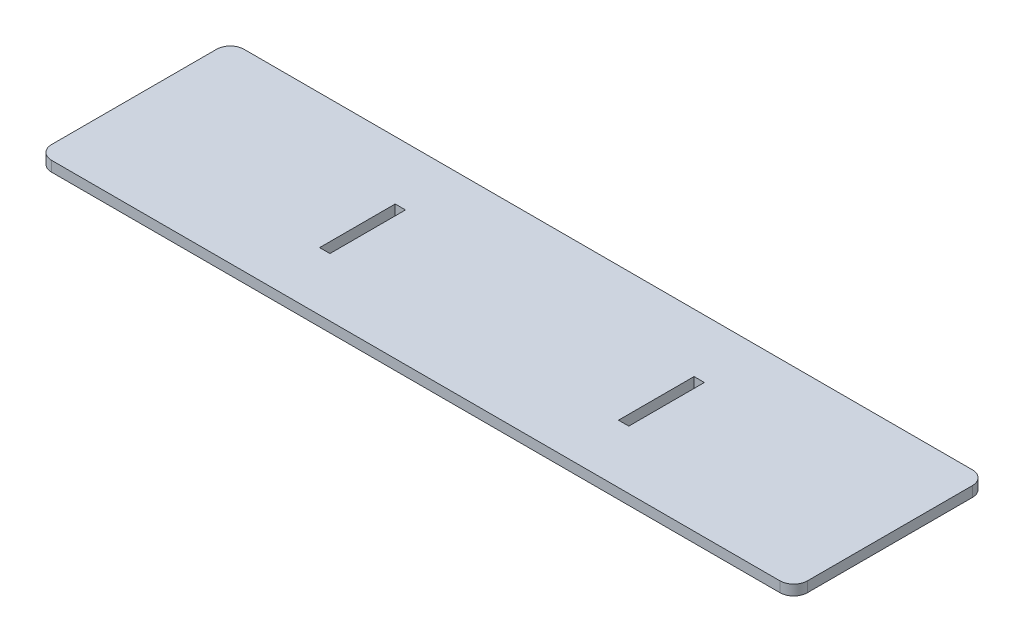
ISO-10303-21;
HEADER;
FILE_DESCRIPTION(('STEP AP214'),'2;1');
FILE_NAME('part.step','',(''),(''),'','','');
FILE_SCHEMA(('AUTOMOTIVE_DESIGN { 1 0 10303 214 1 1 1 1 }'));
ENDSEC;
DATA;
#1=APPLICATION_CONTEXT('core data for automotive mechanical design processes');
#2=APPLICATION_PROTOCOL_DEFINITION('international standard','automotive_design',2000,#1);
#3=PRODUCT_CONTEXT('',#1,'mechanical');
#4=PRODUCT('Part','Part','',(#3));
#5=PRODUCT_RELATED_PRODUCT_CATEGORY('part','',(#4));
#6=PRODUCT_DEFINITION_FORMATION('','',#4);
#7=PRODUCT_DEFINITION_CONTEXT('part definition',#1,'design');
#8=PRODUCT_DEFINITION('design','',#6,#7);
#9=PRODUCT_DEFINITION_SHAPE('','',#8);
#10=(LENGTH_UNIT() NAMED_UNIT(*) SI_UNIT(.MILLI.,.METRE.));
#11=(NAMED_UNIT(*) PLANE_ANGLE_UNIT() SI_UNIT($,.RADIAN.));
#12=(NAMED_UNIT(*) SI_UNIT($,.STERADIAN.) SOLID_ANGLE_UNIT());
#13=UNCERTAINTY_MEASURE_WITH_UNIT(LENGTH_MEASURE(1.E-05),#10,'distance_accuracy_value','');
#14=(GEOMETRIC_REPRESENTATION_CONTEXT(3) GLOBAL_UNCERTAINTY_ASSIGNED_CONTEXT((#13)) GLOBAL_UNIT_ASSIGNED_CONTEXT((#10,
#11,#12)) REPRESENTATION_CONTEXT('',''));
#15=CARTESIAN_POINT('',(0.,0.,0.));
#16=DIRECTION('',(0.,0.,1.));
#17=DIRECTION('',(1.,0.,0.));
#18=AXIS2_PLACEMENT_3D('',#15,#16,#17);
#19=CARTESIAN_POINT('',(-106.,3.,24.));
#20=DIRECTION('',(0.,-1.,0.));
#21=DIRECTION('',(0.,0.,-1.));
#22=AXIS2_PLACEMENT_3D('',#19,#20,#21);
#23=CYLINDRICAL_SURFACE('',#22,4.);
#24=CARTESIAN_POINT('',(-106.,0.,24.));
#25=DIRECTION('',(0.,1.,0.));
#26=DIRECTION('',(0.,0.,1.));
#27=AXIS2_PLACEMENT_3D('',#24,#25,#26);
#28=CIRCLE('',#27,4.);
#29=CARTESIAN_POINT('',(-110.,0.,24.));
#30=VERTEX_POINT('',#29);
#31=CARTESIAN_POINT('',(-106.,0.,28.));
#32=VERTEX_POINT('',#31);
#33=EDGE_CURVE('E182',#30,#32,#28,.T.);
#34=ORIENTED_EDGE('',*,*,#33,.T.);
#35=DIRECTION('',(0.,-1.,0.));
#36=VECTOR('',#35,1.);
#37=CARTESIAN_POINT('',(-106.,3.,28.));
#38=LINE('',#37,#36);
#39=CARTESIAN_POINT('',(-106.,3.,28.));
#40=VERTEX_POINT('',#39);
#41=EDGE_CURVE('E257',#40,#32,#38,.T.);
#42=ORIENTED_EDGE('',*,*,#41,.F.);
#43=CARTESIAN_POINT('',(-106.,3.,24.));
#44=DIRECTION('',(0.,1.,0.));
#45=DIRECTION('',(0.,0.,1.));
#46=AXIS2_PLACEMENT_3D('',#43,#44,#45);
#47=CIRCLE('',#46,4.);
#48=CARTESIAN_POINT('',(-110.,3.,24.));
#49=VERTEX_POINT('',#48);
#50=EDGE_CURVE('E203',#49,#40,#47,.T.);
#51=ORIENTED_EDGE('',*,*,#50,.F.);
#52=DIRECTION('',(0.,-1.,0.));
#53=VECTOR('',#52,1.);
#54=CARTESIAN_POINT('',(-110.,3.,24.));
#55=LINE('',#54,#53);
#56=EDGE_CURVE('E221',#49,#30,#55,.T.);
#57=ORIENTED_EDGE('',*,*,#56,.T.);
#58=EDGE_LOOP('',(#34,#42,#51,#57));
#59=FACE_BOUND('',#58,.T.);
#60=ADVANCED_FACE('F39',(#59),#23,.T.);
#61=CARTESIAN_POINT('',(-106.,3.,28.));
#62=DIRECTION('',(0.,0.,-1.));
#63=DIRECTION('',(-1.,0.,0.));
#64=AXIS2_PLACEMENT_3D('',#61,#62,#63);
#65=PLANE('',#64);
#66=DIRECTION('',(1.,0.,0.));
#67=VECTOR('',#66,1.);
#68=CARTESIAN_POINT('',(-106.,0.,28.));
#69=LINE('',#68,#67);
#70=CARTESIAN_POINT('',(106.,0.,28.));
#71=VERTEX_POINT('',#70);
#72=EDGE_CURVE('E224',#32,#71,#69,.T.);
#73=ORIENTED_EDGE('',*,*,#72,.T.);
#74=DIRECTION('',(0.,-1.,0.));
#75=VECTOR('',#74,1.);
#76=CARTESIAN_POINT('',(106.,3.,28.));
#77=LINE('',#76,#75);
#78=CARTESIAN_POINT('',(106.,3.,28.));
#79=VERTEX_POINT('',#78);
#80=EDGE_CURVE('E254',#79,#71,#77,.T.);
#81=ORIENTED_EDGE('',*,*,#80,.F.);
#82=DIRECTION('',(1.,0.,0.));
#83=VECTOR('',#82,1.);
#84=CARTESIAN_POINT('',(-106.,3.,28.));
#85=LINE('',#84,#83);
#86=EDGE_CURVE('E206',#40,#79,#85,.T.);
#87=ORIENTED_EDGE('',*,*,#86,.F.);
#88=ORIENTED_EDGE('',*,*,#41,.T.);
#89=EDGE_LOOP('',(#73,#81,#87,#88));
#90=FACE_BOUND('',#89,.T.);
#91=ADVANCED_FACE('F296',(#90),#65,.F.);
#92=CARTESIAN_POINT('',(106.,3.,24.));
#93=DIRECTION('',(0.,-1.,0.));
#94=DIRECTION('',(0.,0.,-1.));
#95=AXIS2_PLACEMENT_3D('',#92,#93,#94);
#96=CYLINDRICAL_SURFACE('',#95,4.);
#97=CARTESIAN_POINT('',(106.,0.,24.));
#98=DIRECTION('',(0.,1.,0.));
#99=DIRECTION('',(0.,0.,1.));
#100=AXIS2_PLACEMENT_3D('',#97,#98,#99);
#101=CIRCLE('',#100,4.);
#102=CARTESIAN_POINT('',(110.,0.,24.));
#103=VERTEX_POINT('',#102);
#104=EDGE_CURVE('E226',#71,#103,#101,.T.);
#105=ORIENTED_EDGE('',*,*,#104,.T.);
#106=DIRECTION('',(0.,-1.,0.));
#107=VECTOR('',#106,1.);
#108=CARTESIAN_POINT('',(110.,3.,24.));
#109=LINE('',#108,#107);
#110=CARTESIAN_POINT('',(110.,3.,24.));
#111=VERTEX_POINT('',#110);
#112=EDGE_CURVE('E251',#111,#103,#109,.T.);
#113=ORIENTED_EDGE('',*,*,#112,.F.);
#114=CARTESIAN_POINT('',(106.,3.,24.));
#115=DIRECTION('',(0.,1.,0.));
#116=DIRECTION('',(0.,0.,1.));
#117=AXIS2_PLACEMENT_3D('',#114,#115,#116);
#118=CIRCLE('',#117,4.);
#119=EDGE_CURVE('E209',#79,#111,#118,.T.);
#120=ORIENTED_EDGE('',*,*,#119,.F.);
#121=ORIENTED_EDGE('',*,*,#80,.T.);
#122=EDGE_LOOP('',(#105,#113,#120,#121));
#123=FACE_BOUND('',#122,.T.);
#124=ADVANCED_FACE('F301',(#123),#96,.T.);
#125=CARTESIAN_POINT('',(110.,3.,24.));
#126=DIRECTION('',(-1.,0.,0.));
#127=DIRECTION('',(0.,0.,1.));
#128=AXIS2_PLACEMENT_3D('',#125,#126,#127);
#129=PLANE('',#128);
#130=DIRECTION('',(0.,0.,-1.));
#131=VECTOR('',#130,1.);
#132=CARTESIAN_POINT('',(110.,0.,24.));
#133=LINE('',#132,#131);
#134=CARTESIAN_POINT('',(110.,0.,-24.));
#135=VERTEX_POINT('',#134);
#136=EDGE_CURVE('E228',#103,#135,#133,.T.);
#137=ORIENTED_EDGE('',*,*,#136,.T.);
#138=DIRECTION('',(0.,-1.,0.));
#139=VECTOR('',#138,1.);
#140=CARTESIAN_POINT('',(110.,3.,-24.));
#141=LINE('',#140,#139);
#142=CARTESIAN_POINT('',(110.,3.,-24.));
#143=VERTEX_POINT('',#142);
#144=EDGE_CURVE('E248',#143,#135,#141,.T.);
#145=ORIENTED_EDGE('',*,*,#144,.F.);
#146=DIRECTION('',(0.,0.,-1.));
#147=VECTOR('',#146,1.);
#148=CARTESIAN_POINT('',(110.,3.,24.));
#149=LINE('',#148,#147);
#150=EDGE_CURVE('E211',#111,#143,#149,.T.);
#151=ORIENTED_EDGE('',*,*,#150,.F.);
#152=ORIENTED_EDGE('',*,*,#112,.T.);
#153=EDGE_LOOP('',(#137,#145,#151,#152));
#154=FACE_BOUND('',#153,.T.);
#155=ADVANCED_FACE('F335',(#154),#129,.F.);
#156=CARTESIAN_POINT('',(106.,3.,-24.));
#157=DIRECTION('',(0.,-1.,0.));
#158=DIRECTION('',(0.,0.,-1.));
#159=AXIS2_PLACEMENT_3D('',#156,#157,#158);
#160=CYLINDRICAL_SURFACE('',#159,4.);
#161=CARTESIAN_POINT('',(106.,0.,-24.));
#162=DIRECTION('',(0.,1.,0.));
#163=DIRECTION('',(0.,0.,1.));
#164=AXIS2_PLACEMENT_3D('',#161,#162,#163);
#165=CIRCLE('',#164,4.);
#166=CARTESIAN_POINT('',(106.,0.,-28.));
#167=VERTEX_POINT('',#166);
#168=EDGE_CURVE('E230',#135,#167,#165,.T.);
#169=ORIENTED_EDGE('',*,*,#168,.T.);
#170=DIRECTION('',(0.,-1.,0.));
#171=VECTOR('',#170,1.);
#172=CARTESIAN_POINT('',(106.,3.,-28.));
#173=LINE('',#172,#171);
#174=CARTESIAN_POINT('',(106.,3.,-28.));
#175=VERTEX_POINT('',#174);
#176=EDGE_CURVE('E245',#175,#167,#173,.T.);
#177=ORIENTED_EDGE('',*,*,#176,.F.);
#178=CARTESIAN_POINT('',(106.,3.,-24.));
#179=DIRECTION('',(0.,1.,0.));
#180=DIRECTION('',(0.,0.,1.));
#181=AXIS2_PLACEMENT_3D('',#178,#179,#180);
#182=CIRCLE('',#181,4.);
#183=EDGE_CURVE('E213',#143,#175,#182,.T.);
#184=ORIENTED_EDGE('',*,*,#183,.F.);
#185=ORIENTED_EDGE('',*,*,#144,.T.);
#186=EDGE_LOOP('',(#169,#177,#184,#185));
#187=FACE_BOUND('',#186,.T.);
#188=ADVANCED_FACE('F331',(#187),#160,.T.);
#189=CARTESIAN_POINT('',(106.,3.,-28.));
#190=DIRECTION('',(0.,0.,1.));
#191=DIRECTION('',(1.,0.,0.));
#192=AXIS2_PLACEMENT_3D('',#189,#190,#191);
#193=PLANE('',#192);
#194=DIRECTION('',(-1.,0.,0.));
#195=VECTOR('',#194,1.);
#196=CARTESIAN_POINT('',(106.,0.,-28.));
#197=LINE('',#196,#195);
#198=CARTESIAN_POINT('',(-106.,0.,-28.));
#199=VERTEX_POINT('',#198);
#200=EDGE_CURVE('E232',#167,#199,#197,.T.);
#201=ORIENTED_EDGE('',*,*,#200,.T.);
#202=DIRECTION('',(0.,-1.,0.));
#203=VECTOR('',#202,1.);
#204=CARTESIAN_POINT('',(-106.,3.,-28.));
#205=LINE('',#204,#203);
#206=CARTESIAN_POINT('',(-106.,3.,-28.));
#207=VERTEX_POINT('',#206);
#208=EDGE_CURVE('E242',#207,#199,#205,.T.);
#209=ORIENTED_EDGE('',*,*,#208,.F.);
#210=DIRECTION('',(-1.,0.,0.));
#211=VECTOR('',#210,1.);
#212=CARTESIAN_POINT('',(106.,3.,-28.));
#213=LINE('',#212,#211);
#214=EDGE_CURVE('E215',#175,#207,#213,.T.);
#215=ORIENTED_EDGE('',*,*,#214,.F.);
#216=ORIENTED_EDGE('',*,*,#176,.T.);
#217=EDGE_LOOP('',(#201,#209,#215,#216));
#218=FACE_BOUND('',#217,.T.);
#219=ADVANCED_FACE('F326',(#218),#193,.F.);
#220=CARTESIAN_POINT('',(-106.,3.,-24.));
#221=DIRECTION('',(0.,-1.,0.));
#222=DIRECTION('',(0.,0.,-1.));
#223=AXIS2_PLACEMENT_3D('',#220,#221,#222);
#224=CYLINDRICAL_SURFACE('',#223,4.);
#225=CARTESIAN_POINT('',(-106.,0.,-24.));
#226=DIRECTION('',(0.,1.,0.));
#227=DIRECTION('',(0.,0.,1.));
#228=AXIS2_PLACEMENT_3D('',#225,#226,#227);
#229=CIRCLE('',#228,4.);
#230=CARTESIAN_POINT('',(-110.,0.,-24.));
#231=VERTEX_POINT('',#230);
#232=EDGE_CURVE('E234',#199,#231,#229,.T.);
#233=ORIENTED_EDGE('',*,*,#232,.T.);
#234=DIRECTION('',(0.,-1.,0.));
#235=VECTOR('',#234,1.);
#236=CARTESIAN_POINT('',(-110.,3.,-24.));
#237=LINE('',#236,#235);
#238=CARTESIAN_POINT('',(-110.,3.,-24.));
#239=VERTEX_POINT('',#238);
#240=EDGE_CURVE('E239',#239,#231,#237,.T.);
#241=ORIENTED_EDGE('',*,*,#240,.F.);
#242=CARTESIAN_POINT('',(-106.,3.,-24.));
#243=DIRECTION('',(0.,1.,0.));
#244=DIRECTION('',(0.,0.,1.));
#245=AXIS2_PLACEMENT_3D('',#242,#243,#244);
#246=CIRCLE('',#245,4.);
#247=EDGE_CURVE('E217',#207,#239,#246,.T.);
#248=ORIENTED_EDGE('',*,*,#247,.F.);
#249=ORIENTED_EDGE('',*,*,#208,.T.);
#250=EDGE_LOOP('',(#233,#241,#248,#249));
#251=FACE_BOUND('',#250,.T.);
#252=ADVANCED_FACE('F321',(#251),#224,.T.);
#253=CARTESIAN_POINT('',(-110.,3.,-24.));
#254=DIRECTION('',(1.,0.,0.));
#255=DIRECTION('',(0.,0.,-1.));
#256=AXIS2_PLACEMENT_3D('',#253,#254,#255);
#257=PLANE('',#256);
#258=DIRECTION('',(0.,0.,1.));
#259=VECTOR('',#258,1.);
#260=CARTESIAN_POINT('',(-110.,0.,-24.));
#261=LINE('',#260,#259);
#262=EDGE_CURVE('E207',#231,#30,#261,.T.);
#263=ORIENTED_EDGE('',*,*,#262,.T.);
#264=ORIENTED_EDGE('',*,*,#56,.F.);
#265=DIRECTION('',(0.,0.,1.));
#266=VECTOR('',#265,1.);
#267=CARTESIAN_POINT('',(-110.,3.,-24.));
#268=LINE('',#267,#266);
#269=EDGE_CURVE('E219',#239,#49,#268,.T.);
#270=ORIENTED_EDGE('',*,*,#269,.F.);
#271=ORIENTED_EDGE('',*,*,#240,.T.);
#272=EDGE_LOOP('',(#263,#264,#270,#271));
#273=FACE_BOUND('',#272,.T.);
#274=ADVANCED_FACE('F319',(#273),#257,.F.);
#275=CARTESIAN_POINT('',(-106.,3.,24.));
#276=DIRECTION('',(0.,1.,0.));
#277=DIRECTION('',(0.,0.,1.));
#278=AXIS2_PLACEMENT_3D('',#275,#276,#277);
#279=PLANE('',#278);
#280=DIRECTION('',(0.,0.,1.));
#281=VECTOR('',#280,1.);
#282=CARTESIAN_POINT('',(-45.,3.,11.));
#283=LINE('',#282,#281);
#284=CARTESIAN_POINT('',(-45.,3.,-11.));
#285=VERTEX_POINT('',#284);
#286=CARTESIAN_POINT('',(-45.,3.,11.));
#287=VERTEX_POINT('',#286);
#288=EDGE_CURVE('E53',#285,#287,#283,.T.);
#289=ORIENTED_EDGE('',*,*,#288,.F.);
#290=DIRECTION('',(-1.,0.,0.));
#291=VECTOR('',#290,1.);
#292=CARTESIAN_POINT('',(-45.,3.,-11.));
#293=LINE('',#292,#291);
#294=CARTESIAN_POINT('',(-42.,3.,-11.));
#295=VERTEX_POINT('',#294);
#296=EDGE_CURVE('E175',#295,#285,#293,.T.);
#297=ORIENTED_EDGE('',*,*,#296,.F.);
#298=DIRECTION('',(0.,0.,-1.));
#299=VECTOR('',#298,1.);
#300=CARTESIAN_POINT('',(-42.,3.,-11.));
#301=LINE('',#300,#299);
#302=CARTESIAN_POINT('',(-42.,3.,11.));
#303=VERTEX_POINT('',#302);
#304=EDGE_CURVE('E158',#303,#295,#301,.T.);
#305=ORIENTED_EDGE('',*,*,#304,.F.);
#306=DIRECTION('',(1.,0.,0.));
#307=VECTOR('',#306,1.);
#308=CARTESIAN_POINT('',(-42.,3.,11.));
#309=LINE('',#308,#307);
#310=EDGE_CURVE('E168',#287,#303,#309,.T.);
#311=ORIENTED_EDGE('',*,*,#310,.F.);
#312=EDGE_LOOP('',(#289,#297,#305,#311));
#313=FACE_BOUND('',#312,.T.);
#314=DIRECTION('',(0.,0.,1.));
#315=VECTOR('',#314,1.);
#316=CARTESIAN_POINT('',(42.,3.,11.));
#317=LINE('',#316,#315);
#318=CARTESIAN_POINT('',(42.,3.,-11.));
#319=VERTEX_POINT('',#318);
#320=CARTESIAN_POINT('',(42.,3.,11.));
#321=VERTEX_POINT('',#320);
#322=EDGE_CURVE('E61',#319,#321,#317,.T.);
#323=ORIENTED_EDGE('',*,*,#322,.F.);
#324=DIRECTION('',(-1.,0.,0.));
#325=VECTOR('',#324,1.);
#326=CARTESIAN_POINT('',(42.,3.,-11.));
#327=LINE('',#326,#325);
#328=CARTESIAN_POINT('',(45.,3.,-11.));
#329=VERTEX_POINT('',#328);
#330=EDGE_CURVE('E187',#329,#319,#327,.T.);
#331=ORIENTED_EDGE('',*,*,#330,.F.);
#332=DIRECTION('',(0.,0.,-1.));
#333=VECTOR('',#332,1.);
#334=CARTESIAN_POINT('',(45.,3.,-11.));
#335=LINE('',#334,#333);
#336=CARTESIAN_POINT('',(45.,3.,11.));
#337=VERTEX_POINT('',#336);
#338=EDGE_CURVE('E196',#337,#329,#335,.T.);
#339=ORIENTED_EDGE('',*,*,#338,.F.);
#340=DIRECTION('',(1.,0.,0.));
#341=VECTOR('',#340,1.);
#342=CARTESIAN_POINT('',(45.,3.,11.));
#343=LINE('',#342,#341);
#344=EDGE_CURVE('E199',#321,#337,#343,.T.);
#345=ORIENTED_EDGE('',*,*,#344,.F.);
#346=EDGE_LOOP('',(#323,#331,#339,#345));
#347=FACE_BOUND('',#346,.T.);
#348=ORIENTED_EDGE('',*,*,#50,.T.);
#349=ORIENTED_EDGE('',*,*,#86,.T.);
#350=ORIENTED_EDGE('',*,*,#119,.T.);
#351=ORIENTED_EDGE('',*,*,#150,.T.);
#352=ORIENTED_EDGE('',*,*,#183,.T.);
#353=ORIENTED_EDGE('',*,*,#214,.T.);
#354=ORIENTED_EDGE('',*,*,#247,.T.);
#355=ORIENTED_EDGE('',*,*,#269,.T.);
#356=EDGE_LOOP('',(#348,#349,#350,#351,#352,#353,#354,#355));
#357=FACE_BOUND('',#356,.T.);
#358=ADVANCED_FACE('F172',(#313,#347,#357),#279,.T.);
#359=CARTESIAN_POINT('',(-106.,0.,24.));
#360=DIRECTION('',(0.,1.,0.));
#361=DIRECTION('',(0.,0.,1.));
#362=AXIS2_PLACEMENT_3D('',#359,#360,#361);
#363=PLANE('',#362);
#364=DIRECTION('',(-1.,0.,0.));
#365=VECTOR('',#364,1.);
#366=CARTESIAN_POINT('',(-106.,0.,-11.));
#367=LINE('',#366,#365);
#368=CARTESIAN_POINT('',(-42.,0.,-11.));
#369=VERTEX_POINT('',#368);
#370=CARTESIAN_POINT('',(-45.,0.,-11.));
#371=VERTEX_POINT('',#370);
#372=EDGE_CURVE('E46',#369,#371,#367,.T.);
#373=ORIENTED_EDGE('',*,*,#372,.T.);
#374=DIRECTION('',(0.,0.,1.));
#375=VECTOR('',#374,1.);
#376=CARTESIAN_POINT('',(-45.,0.,24.));
#377=LINE('',#376,#375);
#378=CARTESIAN_POINT('',(-45.,0.,11.));
#379=VERTEX_POINT('',#378);
#380=EDGE_CURVE('E11',#371,#379,#377,.T.);
#381=ORIENTED_EDGE('',*,*,#380,.T.);
#382=DIRECTION('',(1.,0.,0.));
#383=VECTOR('',#382,1.);
#384=CARTESIAN_POINT('',(-106.,0.,11.));
#385=LINE('',#384,#383);
#386=CARTESIAN_POINT('',(-42.,0.,11.));
#387=VERTEX_POINT('',#386);
#388=EDGE_CURVE('E272',#379,#387,#385,.T.);
#389=ORIENTED_EDGE('',*,*,#388,.T.);
#390=DIRECTION('',(0.,0.,-1.));
#391=VECTOR('',#390,1.);
#392=CARTESIAN_POINT('',(-42.,0.,24.));
#393=LINE('',#392,#391);
#394=EDGE_CURVE('E161',#387,#369,#393,.T.);
#395=ORIENTED_EDGE('',*,*,#394,.T.);
#396=EDGE_LOOP('',(#373,#381,#389,#395));
#397=FACE_BOUND('',#396,.T.);
#398=DIRECTION('',(-1.,0.,0.));
#399=VECTOR('',#398,1.);
#400=CARTESIAN_POINT('',(-106.,0.,-11.));
#401=LINE('',#400,#399);
#402=CARTESIAN_POINT('',(45.,0.,-11.));
#403=VERTEX_POINT('',#402);
#404=CARTESIAN_POINT('',(42.,0.,-11.));
#405=VERTEX_POINT('',#404);
#406=EDGE_CURVE('E266',#403,#405,#401,.T.);
#407=ORIENTED_EDGE('',*,*,#406,.T.);
#408=DIRECTION('',(0.,0.,1.));
#409=VECTOR('',#408,1.);
#410=CARTESIAN_POINT('',(42.,0.,24.));
#411=LINE('',#410,#409);
#412=CARTESIAN_POINT('',(42.,0.,11.));
#413=VERTEX_POINT('',#412);
#414=EDGE_CURVE('E269',#405,#413,#411,.T.);
#415=ORIENTED_EDGE('',*,*,#414,.T.);
#416=DIRECTION('',(1.,0.,0.));
#417=VECTOR('',#416,1.);
#418=CARTESIAN_POINT('',(-106.,0.,11.));
#419=LINE('',#418,#417);
#420=CARTESIAN_POINT('',(45.,0.,11.));
#421=VERTEX_POINT('',#420);
#422=EDGE_CURVE('E260',#413,#421,#419,.T.);
#423=ORIENTED_EDGE('',*,*,#422,.T.);
#424=DIRECTION('',(0.,0.,-1.));
#425=VECTOR('',#424,1.);
#426=CARTESIAN_POINT('',(45.,0.,24.));
#427=LINE('',#426,#425);
#428=EDGE_CURVE('E263',#421,#403,#427,.T.);
#429=ORIENTED_EDGE('',*,*,#428,.T.);
#430=EDGE_LOOP('',(#407,#415,#423,#429));
#431=FACE_BOUND('',#430,.T.);
#432=ORIENTED_EDGE('',*,*,#33,.F.);
#433=ORIENTED_EDGE('',*,*,#262,.F.);
#434=ORIENTED_EDGE('',*,*,#232,.F.);
#435=ORIENTED_EDGE('',*,*,#200,.F.);
#436=ORIENTED_EDGE('',*,*,#168,.F.);
#437=ORIENTED_EDGE('',*,*,#136,.F.);
#438=ORIENTED_EDGE('',*,*,#104,.F.);
#439=ORIENTED_EDGE('',*,*,#72,.F.);
#440=EDGE_LOOP('',(#432,#433,#434,#435,#436,#437,#438,#439));
#441=FACE_BOUND('',#440,.T.);
#442=ADVANCED_FACE('F276',(#397,#431,#441),#363,.F.);
#443=CARTESIAN_POINT('',(42.,-1.2E-05,11.));
#444=DIRECTION('',(-1.,0.,0.));
#445=DIRECTION('',(0.,0.,1.));
#446=AXIS2_PLACEMENT_3D('',#443,#444,#445);
#447=PLANE('',#446);
#448=DIRECTION('',(0.,1.,0.));
#449=VECTOR('',#448,1.);
#450=CARTESIAN_POINT('',(42.,-1.2E-05,-11.));
#451=LINE('',#450,#449);
#452=EDGE_CURVE('E192',#405,#319,#451,.T.);
#453=ORIENTED_EDGE('',*,*,#452,.T.);
#454=ORIENTED_EDGE('',*,*,#322,.T.);
#455=DIRECTION('',(0.,1.,0.));
#456=VECTOR('',#455,1.);
#457=CARTESIAN_POINT('',(42.,-1.2E-05,11.));
#458=LINE('',#457,#456);
#459=EDGE_CURVE('E185',#413,#321,#458,.T.);
#460=ORIENTED_EDGE('',*,*,#459,.F.);
#461=ORIENTED_EDGE('',*,*,#414,.F.);
#462=EDGE_LOOP('',(#453,#454,#460,#461));
#463=FACE_BOUND('',#462,.T.);
#464=ADVANCED_FACE('F355',(#463),#447,.F.);
#465=CARTESIAN_POINT('',(42.,-1.2E-05,-11.));
#466=DIRECTION('',(0.,0.,-1.));
#467=DIRECTION('',(-1.,0.,0.));
#468=AXIS2_PLACEMENT_3D('',#465,#466,#467);
#469=PLANE('',#468);
#470=DIRECTION('',(0.,1.,0.));
#471=VECTOR('',#470,1.);
#472=CARTESIAN_POINT('',(45.,-1.2E-05,-11.));
#473=LINE('',#472,#471);
#474=EDGE_CURVE('E190',#403,#329,#473,.T.);
#475=ORIENTED_EDGE('',*,*,#474,.T.);
#476=ORIENTED_EDGE('',*,*,#330,.T.);
#477=ORIENTED_EDGE('',*,*,#452,.F.);
#478=ORIENTED_EDGE('',*,*,#406,.F.);
#479=EDGE_LOOP('',(#475,#476,#477,#478));
#480=FACE_BOUND('',#479,.T.);
#481=ADVANCED_FACE('F358',(#480),#469,.F.);
#482=CARTESIAN_POINT('',(45.,-1.2E-05,-11.));
#483=DIRECTION('',(1.,0.,0.));
#484=DIRECTION('',(0.,0.,-1.));
#485=AXIS2_PLACEMENT_3D('',#482,#483,#484);
#486=PLANE('',#485);
#487=DIRECTION('',(0.,1.,0.));
#488=VECTOR('',#487,1.);
#489=CARTESIAN_POINT('',(45.,-1.2E-05,11.));
#490=LINE('',#489,#488);
#491=EDGE_CURVE('E188',#421,#337,#490,.T.);
#492=ORIENTED_EDGE('',*,*,#491,.T.);
#493=ORIENTED_EDGE('',*,*,#338,.T.);
#494=ORIENTED_EDGE('',*,*,#474,.F.);
#495=ORIENTED_EDGE('',*,*,#428,.F.);
#496=EDGE_LOOP('',(#492,#493,#494,#495));
#497=FACE_BOUND('',#496,.T.);
#498=ADVANCED_FACE('F290',(#497),#486,.F.);
#499=CARTESIAN_POINT('',(45.,-1.2E-05,11.));
#500=DIRECTION('',(0.,0.,1.));
#501=DIRECTION('',(1.,0.,0.));
#502=AXIS2_PLACEMENT_3D('',#499,#500,#501);
#503=PLANE('',#502);
#504=ORIENTED_EDGE('',*,*,#459,.T.);
#505=ORIENTED_EDGE('',*,*,#344,.T.);
#506=ORIENTED_EDGE('',*,*,#491,.F.);
#507=ORIENTED_EDGE('',*,*,#422,.F.);
#508=EDGE_LOOP('',(#504,#505,#506,#507));
#509=FACE_BOUND('',#508,.T.);
#510=ADVANCED_FACE('F283',(#509),#503,.F.);
#511=CARTESIAN_POINT('',(-45.,-1.2E-05,11.));
#512=DIRECTION('',(-1.,0.,0.));
#513=DIRECTION('',(0.,0.,1.));
#514=AXIS2_PLACEMENT_3D('',#511,#512,#513);
#515=PLANE('',#514);
#516=DIRECTION('',(0.,1.,0.));
#517=VECTOR('',#516,1.);
#518=CARTESIAN_POINT('',(-45.,-1.2E-05,-11.));
#519=LINE('',#518,#517);
#520=EDGE_CURVE('E180',#371,#285,#519,.T.);
#521=ORIENTED_EDGE('',*,*,#520,.T.);
#522=ORIENTED_EDGE('',*,*,#288,.T.);
#523=DIRECTION('',(0.,1.,0.));
#524=VECTOR('',#523,1.);
#525=CARTESIAN_POINT('',(-45.,-1.2E-05,11.));
#526=LINE('',#525,#524);
#527=EDGE_CURVE('E165',#379,#287,#526,.T.);
#528=ORIENTED_EDGE('',*,*,#527,.F.);
#529=ORIENTED_EDGE('',*,*,#380,.F.);
#530=EDGE_LOOP('',(#521,#522,#528,#529));
#531=FACE_BOUND('',#530,.T.);
#532=ADVANCED_FACE('F281',(#531),#515,.F.);
#533=CARTESIAN_POINT('',(-45.,-1.2E-05,-11.));
#534=DIRECTION('',(0.,0.,-1.));
#535=DIRECTION('',(-1.,0.,0.));
#536=AXIS2_PLACEMENT_3D('',#533,#534,#535);
#537=PLANE('',#536);
#538=DIRECTION('',(0.,1.,0.));
#539=VECTOR('',#538,1.);
#540=CARTESIAN_POINT('',(-42.,-1.2E-05,-11.));
#541=LINE('',#540,#539);
#542=EDGE_CURVE('E164',#369,#295,#541,.T.);
#543=ORIENTED_EDGE('',*,*,#542,.T.);
#544=ORIENTED_EDGE('',*,*,#296,.T.);
#545=ORIENTED_EDGE('',*,*,#520,.F.);
#546=ORIENTED_EDGE('',*,*,#372,.F.);
#547=EDGE_LOOP('',(#543,#544,#545,#546));
#548=FACE_BOUND('',#547,.T.);
#549=ADVANCED_FACE('F280',(#548),#537,.F.);
#550=CARTESIAN_POINT('',(-42.,-1.2E-05,-11.));
#551=DIRECTION('',(1.,0.,0.));
#552=DIRECTION('',(0.,0.,-1.));
#553=AXIS2_PLACEMENT_3D('',#550,#551,#552);
#554=PLANE('',#553);
#555=DIRECTION('',(0.,1.,0.));
#556=VECTOR('',#555,1.);
#557=CARTESIAN_POINT('',(-42.,-1.2E-05,11.));
#558=LINE('',#557,#556);
#559=EDGE_CURVE('E153',#387,#303,#558,.T.);
#560=ORIENTED_EDGE('',*,*,#559,.T.);
#561=ORIENTED_EDGE('',*,*,#304,.T.);
#562=ORIENTED_EDGE('',*,*,#542,.F.);
#563=ORIENTED_EDGE('',*,*,#394,.F.);
#564=EDGE_LOOP('',(#560,#561,#562,#563));
#565=FACE_BOUND('',#564,.T.);
#566=ADVANCED_FACE('F155',(#565),#554,.F.);
#567=CARTESIAN_POINT('',(-42.,-1.2E-05,11.));
#568=DIRECTION('',(0.,0.,1.));
#569=DIRECTION('',(1.,0.,0.));
#570=AXIS2_PLACEMENT_3D('',#567,#568,#569);
#571=PLANE('',#570);
#572=ORIENTED_EDGE('',*,*,#527,.T.);
#573=ORIENTED_EDGE('',*,*,#310,.T.);
#574=ORIENTED_EDGE('',*,*,#559,.F.);
#575=ORIENTED_EDGE('',*,*,#388,.F.);
#576=EDGE_LOOP('',(#572,#573,#574,#575));
#577=FACE_BOUND('',#576,.T.);
#578=ADVANCED_FACE('F169',(#577),#571,.F.);
#579=CLOSED_SHELL('',(#60,#91,#124,#155,#188,#219,#252,#274,#358,#442,#464,#481,#498,#510,#532,
#549,#566,#578));
#580=MANIFOLD_SOLID_BREP('B2',#579);
#581=ADVANCED_BREP_SHAPE_REPRESENTATION('',(#18,#580),#14);
#582=SHAPE_DEFINITION_REPRESENTATION(#9,#581);
ENDSEC;
END-ISO-10303-21;
